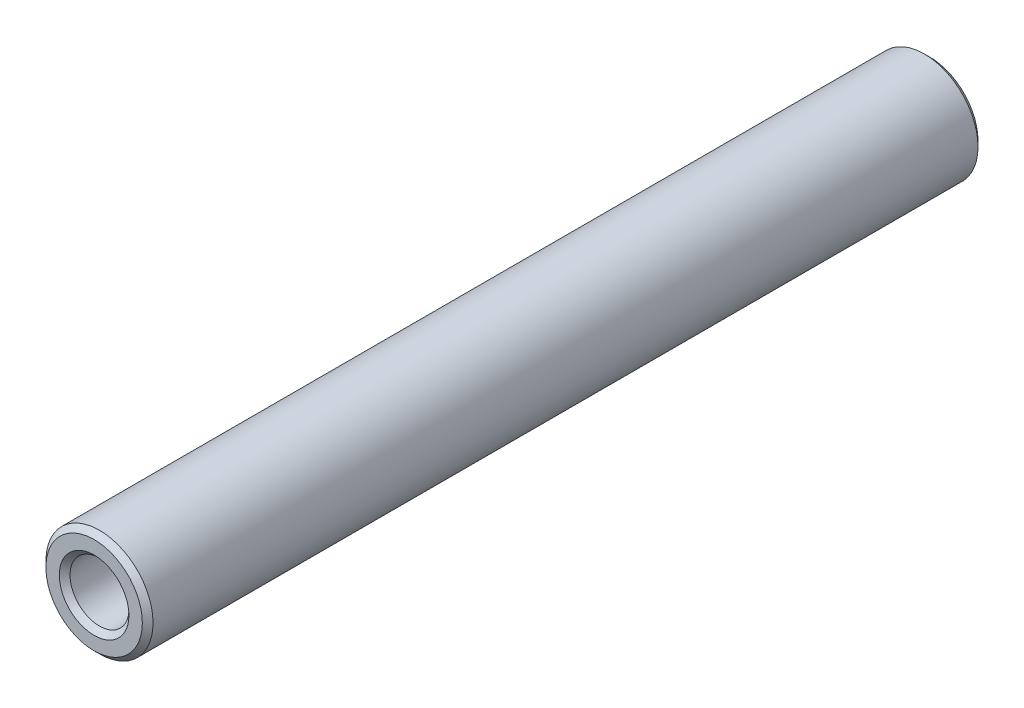
ISO-10303-21;
HEADER;
FILE_DESCRIPTION(('STEP AP214'),'2;1');
FILE_NAME('part.step','',(''),(''),'','','');
FILE_SCHEMA(('AUTOMOTIVE_DESIGN { 1 0 10303 214 1 1 1 1 }'));
ENDSEC;
DATA;
#1=APPLICATION_CONTEXT('core data for automotive mechanical design processes');
#2=APPLICATION_PROTOCOL_DEFINITION('international standard','automotive_design',2000,#1);
#3=PRODUCT_CONTEXT('',#1,'mechanical');
#4=PRODUCT('Part','Part','',(#3));
#5=PRODUCT_RELATED_PRODUCT_CATEGORY('part','',(#4));
#6=PRODUCT_DEFINITION_FORMATION('','',#4);
#7=PRODUCT_DEFINITION_CONTEXT('part definition',#1,'design');
#8=PRODUCT_DEFINITION('design','',#6,#7);
#9=PRODUCT_DEFINITION_SHAPE('','',#8);
#10=(LENGTH_UNIT() NAMED_UNIT(*) SI_UNIT(.MILLI.,.METRE.));
#11=(NAMED_UNIT(*) PLANE_ANGLE_UNIT() SI_UNIT($,.RADIAN.));
#12=(NAMED_UNIT(*) SI_UNIT($,.STERADIAN.) SOLID_ANGLE_UNIT());
#13=UNCERTAINTY_MEASURE_WITH_UNIT(LENGTH_MEASURE(1.E-05),#10,'distance_accuracy_value','');
#14=(GEOMETRIC_REPRESENTATION_CONTEXT(3) GLOBAL_UNCERTAINTY_ASSIGNED_CONTEXT((#13)) GLOBAL_UNIT_ASSIGNED_CONTEXT((#10,
#11,#12)) REPRESENTATION_CONTEXT('',''));
#15=CARTESIAN_POINT('',(0.,0.,0.));
#16=DIRECTION('',(0.,0.,1.));
#17=DIRECTION('',(1.,0.,0.));
#18=AXIS2_PLACEMENT_3D('',#15,#16,#17);
#19=CARTESIAN_POINT('',(0.,0.,39.));
#20=DIRECTION('',(0.,0.,1.));
#21=DIRECTION('',(1.,0.,0.));
#22=AXIS2_PLACEMENT_3D('',#19,#20,#21);
#23=PLANE('',#22);
#24=CARTESIAN_POINT('',(0.,0.,39.));
#25=DIRECTION('',(0.,0.,1.));
#26=DIRECTION('',(1.,0.,0.));
#27=AXIS2_PLACEMENT_3D('',#24,#25,#26);
#28=CIRCLE('',#27,4.50000000000002);
#29=CARTESIAN_POINT('',(4.50000000000002,0.,39.));
#30=VERTEX_POINT('',#29);
#31=EDGE_CURVE('E54',#30,#30,#28,.T.);
#32=ORIENTED_EDGE('',*,*,#31,.T.);
#33=EDGE_LOOP('',(#32));
#34=FACE_BOUND('',#33,.T.);
#35=CARTESIAN_POINT('',(0.,0.,39.));
#36=DIRECTION('',(0.,0.,1.));
#37=DIRECTION('',(1.,0.,0.));
#38=AXIS2_PLACEMENT_3D('',#35,#36,#37);
#39=CIRCLE('',#38,3.25000000000002);
#40=CARTESIAN_POINT('',(3.25000000000002,0.,39.));
#41=VERTEX_POINT('',#40);
#42=EDGE_CURVE('E58',#41,#41,#39,.F.);
#43=ORIENTED_EDGE('',*,*,#42,.T.);
#44=EDGE_LOOP('',(#43));
#45=FACE_BOUND('',#44,.T.);
#46=ADVANCED_FACE('F39',(#34,#45),#23,.T.);
#47=CARTESIAN_POINT('',(0.,0.,-39.));
#48=DIRECTION('',(0.,0.,1.));
#49=DIRECTION('',(1.,0.,0.));
#50=AXIS2_PLACEMENT_3D('',#47,#48,#49);
#51=PLANE('',#50);
#52=CARTESIAN_POINT('',(0.,0.,-39.));
#53=DIRECTION('',(0.,0.,1.));
#54=DIRECTION('',(1.,0.,0.));
#55=AXIS2_PLACEMENT_3D('',#52,#53,#54);
#56=CIRCLE('',#55,4.5);
#57=CARTESIAN_POINT('',(4.5,0.,-39.));
#58=VERTEX_POINT('',#57);
#59=EDGE_CURVE('E10',#58,#58,#56,.F.);
#60=ORIENTED_EDGE('',*,*,#59,.T.);
#61=EDGE_LOOP('',(#60));
#62=FACE_BOUND('',#61,.T.);
#63=CARTESIAN_POINT('',(0.,0.,-39.));
#64=DIRECTION('',(0.,0.,1.));
#65=DIRECTION('',(1.,0.,0.));
#66=AXIS2_PLACEMENT_3D('',#63,#64,#65);
#67=CIRCLE('',#66,3.25);
#68=CARTESIAN_POINT('',(3.25,0.,-39.));
#69=VERTEX_POINT('',#68);
#70=EDGE_CURVE('E66',#69,#69,#67,.T.);
#71=ORIENTED_EDGE('',*,*,#70,.T.);
#72=EDGE_LOOP('',(#71));
#73=FACE_BOUND('',#72,.T.);
#74=ADVANCED_FACE('F74',(#62,#73),#51,.F.);
#75=CARTESIAN_POINT('',(0.,0.,39.));
#76=DIRECTION('',(0.,0.,-1.));
#77=DIRECTION('',(-1.,0.,0.));
#78=AXIS2_PLACEMENT_3D('',#75,#76,#77);
#79=CYLINDRICAL_SURFACE('',#78,5.);
#80=CARTESIAN_POINT('',(0.,0.,38.5));
#81=DIRECTION('',(0.,0.,1.));
#82=DIRECTION('',(1.,0.,0.));
#83=AXIS2_PLACEMENT_3D('',#80,#81,#82);
#84=CIRCLE('',#83,5.);
#85=CARTESIAN_POINT('',(5.,0.,38.5));
#86=VERTEX_POINT('',#85);
#87=EDGE_CURVE('E50',#86,#86,#84,.F.);
#88=ORIENTED_EDGE('',*,*,#87,.T.);
#89=EDGE_LOOP('',(#88));
#90=FACE_BOUND('',#89,.T.);
#91=CARTESIAN_POINT('',(0.,0.,-38.5));
#92=DIRECTION('',(0.,0.,1.));
#93=DIRECTION('',(1.,0.,0.));
#94=AXIS2_PLACEMENT_3D('',#91,#92,#93);
#95=CIRCLE('',#94,5.);
#96=CARTESIAN_POINT('',(5.,0.,-38.5));
#97=VERTEX_POINT('',#96);
#98=EDGE_CURVE('E51',#97,#97,#95,.T.);
#99=ORIENTED_EDGE('',*,*,#98,.T.);
#100=EDGE_LOOP('',(#99));
#101=FACE_BOUND('',#100,.T.);
#102=ADVANCED_FACE('F89',(#90,#101),#79,.T.);
#103=CARTESIAN_POINT('',(0.,0.,39.));
#104=DIRECTION('',(0.,0.,-1.));
#105=DIRECTION('',(-1.,0.,0.));
#106=AXIS2_PLACEMENT_3D('',#103,#104,#105);
#107=CYLINDRICAL_SURFACE('',#106,2.75);
#108=CARTESIAN_POINT('',(0.,0.,-38.5));
#109=DIRECTION('',(0.,0.,1.));
#110=DIRECTION('',(1.,0.,0.));
#111=AXIS2_PLACEMENT_3D('',#108,#109,#110);
#112=CIRCLE('',#111,2.75);
#113=CARTESIAN_POINT('',(2.75,0.,-38.5));
#114=VERTEX_POINT('',#113);
#115=EDGE_CURVE('E64',#114,#114,#112,.F.);
#116=ORIENTED_EDGE('',*,*,#115,.T.);
#117=EDGE_LOOP('',(#116));
#118=FACE_BOUND('',#117,.T.);
#119=CARTESIAN_POINT('',(0.,0.,38.5));
#120=DIRECTION('',(0.,0.,1.));
#121=DIRECTION('',(1.,0.,0.));
#122=AXIS2_PLACEMENT_3D('',#119,#120,#121);
#123=CIRCLE('',#122,2.75);
#124=CARTESIAN_POINT('',(2.75,0.,38.5));
#125=VERTEX_POINT('',#124);
#126=EDGE_CURVE('E67',#125,#125,#123,.T.);
#127=ORIENTED_EDGE('',*,*,#126,.T.);
#128=EDGE_LOOP('',(#127));
#129=FACE_BOUND('',#128,.T.);
#130=ADVANCED_FACE('F76',(#118,#129),#107,.F.);
#131=CARTESIAN_POINT('',(0.,0.,-39.));
#132=DIRECTION('',(0.,0.,-1.));
#133=DIRECTION('',(-1.,0.,0.));
#134=AXIS2_PLACEMENT_3D('',#131,#132,#133);
#135=CONICAL_SURFACE('',#134,3.25,0.785398163397437);
#136=ORIENTED_EDGE('',*,*,#115,.F.);
#137=EDGE_LOOP('',(#136));
#138=FACE_BOUND('',#137,.T.);
#139=ORIENTED_EDGE('',*,*,#70,.F.);
#140=EDGE_LOOP('',(#139));
#141=FACE_BOUND('',#140,.T.);
#142=ADVANCED_FACE('F73',(#138,#141),#135,.F.);
#143=CARTESIAN_POINT('',(0.,0.,38.5));
#144=DIRECTION('',(0.,0.,1.));
#145=DIRECTION('',(1.,0.,0.));
#146=AXIS2_PLACEMENT_3D('',#143,#144,#145);
#147=CONICAL_SURFACE('',#146,2.75,0.785398163397451);
#148=ORIENTED_EDGE('',*,*,#42,.F.);
#149=EDGE_LOOP('',(#148));
#150=FACE_BOUND('',#149,.T.);
#151=ORIENTED_EDGE('',*,*,#126,.F.);
#152=EDGE_LOOP('',(#151));
#153=FACE_BOUND('',#152,.T.);
#154=ADVANCED_FACE('F80',(#150,#153),#147,.F.);
#155=CARTESIAN_POINT('',(0.,0.,39.));
#156=DIRECTION('',(0.,0.,-1.));
#157=DIRECTION('',(-1.,0.,0.));
#158=AXIS2_PLACEMENT_3D('',#155,#156,#157);
#159=CONICAL_SURFACE('',#158,4.50000000000002,0.785398163397444);
#160=ORIENTED_EDGE('',*,*,#87,.F.);
#161=EDGE_LOOP('',(#160));
#162=FACE_BOUND('',#161,.T.);
#163=ORIENTED_EDGE('',*,*,#31,.F.);
#164=EDGE_LOOP('',(#163));
#165=FACE_BOUND('',#164,.T.);
#166=ADVANCED_FACE('F83',(#162,#165),#159,.T.);
#167=CARTESIAN_POINT('',(0.,0.,-38.5));
#168=DIRECTION('',(0.,0.,1.));
#169=DIRECTION('',(1.,0.,0.));
#170=AXIS2_PLACEMENT_3D('',#167,#168,#169);
#171=CONICAL_SURFACE('',#170,5.,0.785398163397437);
#172=ORIENTED_EDGE('',*,*,#59,.F.);
#173=EDGE_LOOP('',(#172));
#174=FACE_BOUND('',#173,.T.);
#175=ORIENTED_EDGE('',*,*,#98,.F.);
#176=EDGE_LOOP('',(#175));
#177=FACE_BOUND('',#176,.T.);
#178=ADVANCED_FACE('F45',(#174,#177),#171,.T.);
#179=CLOSED_SHELL('',(#46,#74,#102,#130,#142,#154,#166,#178));
#180=MANIFOLD_SOLID_BREP('B2',#179);
#181=ADVANCED_BREP_SHAPE_REPRESENTATION('',(#18,#180),#14);
#182=SHAPE_DEFINITION_REPRESENTATION(#9,#181);
ENDSEC;
END-ISO-10303-21;
